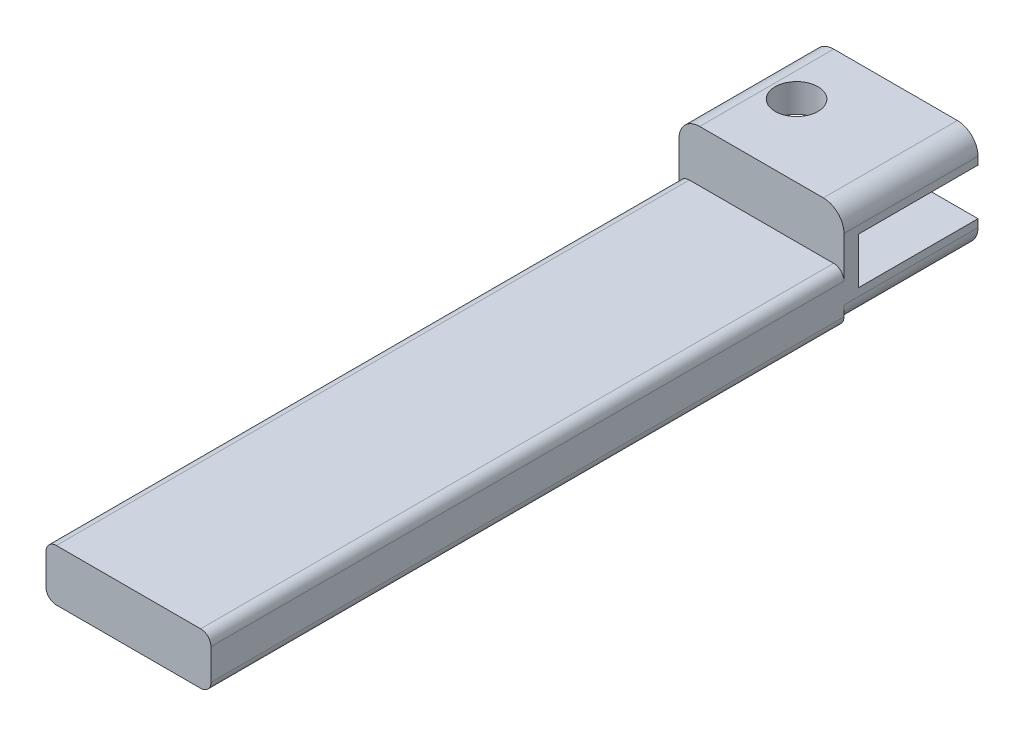
ISO-10303-21;
HEADER;
FILE_DESCRIPTION(('STEP AP214'),'2;1');
FILE_NAME('part.step','',(''),(''),'','','');
FILE_SCHEMA(('AUTOMOTIVE_DESIGN { 1 0 10303 214 1 1 1 1 }'));
ENDSEC;
DATA;
#1=APPLICATION_CONTEXT('core data for automotive mechanical design processes');
#2=APPLICATION_PROTOCOL_DEFINITION('international standard','automotive_design',2000,#1);
#3=PRODUCT_CONTEXT('',#1,'mechanical');
#4=PRODUCT('Part','Part','',(#3));
#5=PRODUCT_RELATED_PRODUCT_CATEGORY('part','',(#4));
#6=PRODUCT_DEFINITION_FORMATION('','',#4);
#7=PRODUCT_DEFINITION_CONTEXT('part definition',#1,'design');
#8=PRODUCT_DEFINITION('design','',#6,#7);
#9=PRODUCT_DEFINITION_SHAPE('','',#8);
#10=(LENGTH_UNIT() NAMED_UNIT(*) SI_UNIT(.MILLI.,.METRE.));
#11=(NAMED_UNIT(*) PLANE_ANGLE_UNIT() SI_UNIT($,.RADIAN.));
#12=(NAMED_UNIT(*) SI_UNIT($,.STERADIAN.) SOLID_ANGLE_UNIT());
#13=UNCERTAINTY_MEASURE_WITH_UNIT(LENGTH_MEASURE(1.E-05),#10,'distance_accuracy_value','');
#14=(GEOMETRIC_REPRESENTATION_CONTEXT(3) GLOBAL_UNCERTAINTY_ASSIGNED_CONTEXT((#13)) GLOBAL_UNIT_ASSIGNED_CONTEXT((#10,
#11,#12)) REPRESENTATION_CONTEXT('',''));
#15=CARTESIAN_POINT('',(0.,0.,0.));
#16=DIRECTION('',(0.,0.,1.));
#17=DIRECTION('',(1.,0.,0.));
#18=AXIS2_PLACEMENT_3D('',#15,#16,#17);
#19=CARTESIAN_POINT('',(8.,-4.,74.40149944));
#20=DIRECTION('',(-1.,0.,0.));
#21=DIRECTION('',(0.,0.,1.));
#22=AXIS2_PLACEMENT_3D('',#19,#20,#21);
#23=PLANE('',#22);
#24=DIRECTION('',(0.,0.,-1.));
#25=VECTOR('',#24,1.);
#26=CARTESIAN_POINT('',(8.,-2.25,74.40149944));
#27=LINE('',#26,#25);
#28=CARTESIAN_POINT('',(8.,-2.25,11.6));
#29=VERTEX_POINT('',#28);
#30=CARTESIAN_POINT('',(8.,-2.25,0.));
#31=VERTEX_POINT('',#30);
#32=EDGE_CURVE('E196',#29,#31,#27,.T.);
#33=ORIENTED_EDGE('',*,*,#32,.F.);
#34=DIRECTION('',(0.,1.,0.));
#35=VECTOR('',#34,1.);
#36=CARTESIAN_POINT('',(8.,-4.,11.6));
#37=LINE('',#36,#35);
#38=CARTESIAN_POINT('',(8.,2.25,11.6));
#39=VERTEX_POINT('',#38);
#40=EDGE_CURVE('E188',#29,#39,#37,.T.);
#41=ORIENTED_EDGE('',*,*,#40,.T.);
#42=DIRECTION('',(0.,0.,1.));
#43=VECTOR('',#42,1.);
#44=CARTESIAN_POINT('',(8.,2.25,74.40149944));
#45=LINE('',#44,#43);
#46=CARTESIAN_POINT('',(8.,2.25,0.));
#47=VERTEX_POINT('',#46);
#48=EDGE_CURVE('E180',#47,#39,#45,.T.);
#49=ORIENTED_EDGE('',*,*,#48,.F.);
#50=DIRECTION('',(0.,1.,0.));
#51=VECTOR('',#50,1.);
#52=CARTESIAN_POINT('',(8.,-3.,0.));
#53=LINE('',#52,#51);
#54=CARTESIAN_POINT('',(8.,3.,0.));
#55=VERTEX_POINT('',#54);
#56=EDGE_CURVE('E221',#47,#55,#53,.T.);
#57=ORIENTED_EDGE('',*,*,#56,.T.);
#58=DIRECTION('',(0.,0.,-1.));
#59=VECTOR('',#58,1.);
#60=CARTESIAN_POINT('',(8.,3.,13.));
#61=LINE('',#60,#59);
#62=CARTESIAN_POINT('',(8.,3.,13.));
#63=VERTEX_POINT('',#62);
#64=EDGE_CURVE('E247',#63,#55,#61,.T.);
#65=ORIENTED_EDGE('',*,*,#64,.F.);
#66=DIRECTION('',(0.,1.,0.));
#67=VECTOR('',#66,1.);
#68=CARTESIAN_POINT('',(8.,-3.,13.));
#69=LINE('',#68,#67);
#70=CARTESIAN_POINT('',(8.,-1.,13.));
#71=VERTEX_POINT('',#70);
#72=EDGE_CURVE('E214',#71,#63,#69,.T.);
#73=ORIENTED_EDGE('',*,*,#72,.F.);
#74=DIRECTION('',(0.,0.,-1.));
#75=VECTOR('',#74,1.);
#76=CARTESIAN_POINT('',(8.,-1.,74.40149944));
#77=LINE('',#76,#75);
#78=CARTESIAN_POINT('',(8.,-1.,74.40149944));
#79=VERTEX_POINT('',#78);
#80=EDGE_CURVE('E309',#79,#71,#77,.T.);
#81=ORIENTED_EDGE('',*,*,#80,.F.);
#82=DIRECTION('',(0.,1.,0.));
#83=VECTOR('',#82,1.);
#84=CARTESIAN_POINT('',(8.,-4.,74.40149944));
#85=LINE('',#84,#83);
#86=CARTESIAN_POINT('',(8.,-4.,74.40149944));
#87=VERTEX_POINT('',#86);
#88=EDGE_CURVE('E269',#87,#79,#85,.T.);
#89=ORIENTED_EDGE('',*,*,#88,.F.);
#90=DIRECTION('',(0.,0.,-1.));
#91=VECTOR('',#90,1.);
#92=CARTESIAN_POINT('',(8.,-4.,74.40149944));
#93=LINE('',#92,#91);
#94=CARTESIAN_POINT('',(8.,-4.,13.));
#95=VERTEX_POINT('',#94);
#96=EDGE_CURVE('E312',#87,#95,#93,.T.);
#97=ORIENTED_EDGE('',*,*,#96,.T.);
#98=DIRECTION('',(0.,1.,0.));
#99=VECTOR('',#98,1.);
#100=CARTESIAN_POINT('',(8.,-4.,13.));
#101=LINE('',#100,#99);
#102=CARTESIAN_POINT('',(8.,-3.,13.));
#103=VERTEX_POINT('',#102);
#104=EDGE_CURVE('E288',#95,#103,#101,.T.);
#105=ORIENTED_EDGE('',*,*,#104,.T.);
#106=DIRECTION('',(0.,0.,-1.));
#107=VECTOR('',#106,1.);
#108=CARTESIAN_POINT('',(8.,-3.,13.));
#109=LINE('',#108,#107);
#110=CARTESIAN_POINT('',(8.,-3.,0.));
#111=VERTEX_POINT('',#110);
#112=EDGE_CURVE('E65',#103,#111,#109,.T.);
#113=ORIENTED_EDGE('',*,*,#112,.T.);
#114=EDGE_CURVE('E228',#111,#31,#53,.T.);
#115=ORIENTED_EDGE('',*,*,#114,.T.);
#116=EDGE_LOOP('',(#33,#41,#49,#57,#65,#73,#81,#89,#97,#105,#113,#115));
#117=FACE_BOUND('',#116,.T.);
#118=ADVANCED_FACE('F39',(#117),#23,.F.);
#119=CARTESIAN_POINT('',(-8.,-1.,74.40149944));
#120=DIRECTION('',(1.,0.,0.));
#121=DIRECTION('',(0.,0.,-1.));
#122=AXIS2_PLACEMENT_3D('',#119,#120,#121);
#123=PLANE('',#122);
#124=DIRECTION('',(0.,0.,1.));
#125=VECTOR('',#124,1.);
#126=CARTESIAN_POINT('',(-8.,-2.25,74.40149944));
#127=LINE('',#126,#125);
#128=CARTESIAN_POINT('',(-8.,-2.25,0.));
#129=VERTEX_POINT('',#128);
#130=CARTESIAN_POINT('',(-8.,-2.25,11.6));
#131=VERTEX_POINT('',#130);
#132=EDGE_CURVE('E184',#129,#131,#127,.T.);
#133=ORIENTED_EDGE('',*,*,#132,.F.);
#134=DIRECTION('',(0.,-1.,0.));
#135=VECTOR('',#134,1.);
#136=CARTESIAN_POINT('',(-8.,3.,0.));
#137=LINE('',#136,#135);
#138=CARTESIAN_POINT('',(-8.,-3.,0.));
#139=VERTEX_POINT('',#138);
#140=EDGE_CURVE('E234',#129,#139,#137,.T.);
#141=ORIENTED_EDGE('',*,*,#140,.T.);
#142=DIRECTION('',(0.,0.,-1.));
#143=VECTOR('',#142,1.);
#144=CARTESIAN_POINT('',(-8.,-3.,13.));
#145=LINE('',#144,#143);
#146=CARTESIAN_POINT('',(-8.,-3.,13.));
#147=VERTEX_POINT('',#146);
#148=EDGE_CURVE('E219',#147,#139,#145,.T.);
#149=ORIENTED_EDGE('',*,*,#148,.F.);
#150=DIRECTION('',(0.,-1.,0.));
#151=VECTOR('',#150,1.);
#152=CARTESIAN_POINT('',(-8.,-1.,13.));
#153=LINE('',#152,#151);
#154=CARTESIAN_POINT('',(-8.,-4.,13.));
#155=VERTEX_POINT('',#154);
#156=EDGE_CURVE('E262',#147,#155,#153,.T.);
#157=ORIENTED_EDGE('',*,*,#156,.T.);
#158=DIRECTION('',(0.,0.,-1.));
#159=VECTOR('',#158,1.);
#160=CARTESIAN_POINT('',(-8.,-4.,74.40149944));
#161=LINE('',#160,#159);
#162=CARTESIAN_POINT('',(-8.,-4.,74.40149944));
#163=VERTEX_POINT('',#162);
#164=EDGE_CURVE('E276',#163,#155,#161,.T.);
#165=ORIENTED_EDGE('',*,*,#164,.F.);
#166=DIRECTION('',(0.,-1.,0.));
#167=VECTOR('',#166,1.);
#168=CARTESIAN_POINT('',(-8.,-1.,74.40149944));
#169=LINE('',#168,#167);
#170=CARTESIAN_POINT('',(-8.,-1.,74.40149944));
#171=VERTEX_POINT('',#170);
#172=EDGE_CURVE('E273',#171,#163,#169,.T.);
#173=ORIENTED_EDGE('',*,*,#172,.F.);
#174=DIRECTION('',(0.,0.,-1.));
#175=VECTOR('',#174,1.);
#176=CARTESIAN_POINT('',(-8.,-1.,74.40149944));
#177=LINE('',#176,#175);
#178=CARTESIAN_POINT('',(-8.,-0.999999999999999,13.));
#179=VERTEX_POINT('',#178);
#180=EDGE_CURVE('E301',#171,#179,#177,.T.);
#181=ORIENTED_EDGE('',*,*,#180,.T.);
#182=DIRECTION('',(0.,-1.,0.));
#183=VECTOR('',#182,1.);
#184=CARTESIAN_POINT('',(-8.,3.,13.));
#185=LINE('',#184,#183);
#186=CARTESIAN_POINT('',(-8.,3.,13.));
#187=VERTEX_POINT('',#186);
#188=EDGE_CURVE('E218',#187,#179,#185,.T.);
#189=ORIENTED_EDGE('',*,*,#188,.F.);
#190=DIRECTION('',(0.,0.,-1.));
#191=VECTOR('',#190,1.);
#192=CARTESIAN_POINT('',(-8.,3.,13.));
#193=LINE('',#192,#191);
#194=CARTESIAN_POINT('',(-8.,3.,0.));
#195=VERTEX_POINT('',#194);
#196=EDGE_CURVE('E237',#187,#195,#193,.T.);
#197=ORIENTED_EDGE('',*,*,#196,.T.);
#198=CARTESIAN_POINT('',(-8.,2.25,0.));
#199=VERTEX_POINT('',#198);
#200=EDGE_CURVE('E209',#195,#199,#137,.T.);
#201=ORIENTED_EDGE('',*,*,#200,.T.);
#202=DIRECTION('',(0.,0.,-1.));
#203=VECTOR('',#202,1.);
#204=CARTESIAN_POINT('',(-8.,2.25,74.40149944));
#205=LINE('',#204,#203);
#206=CARTESIAN_POINT('',(-8.,2.25,11.6));
#207=VERTEX_POINT('',#206);
#208=EDGE_CURVE('E54',#207,#199,#205,.T.);
#209=ORIENTED_EDGE('',*,*,#208,.F.);
#210=DIRECTION('',(0.,-1.,0.));
#211=VECTOR('',#210,1.);
#212=CARTESIAN_POINT('',(-8.,-1.,11.6));
#213=LINE('',#212,#211);
#214=EDGE_CURVE('E11',#207,#131,#213,.T.);
#215=ORIENTED_EDGE('',*,*,#214,.T.);
#216=EDGE_LOOP('',(#133,#141,#149,#157,#165,#173,#181,#189,#197,#201,#209,#215));
#217=FACE_BOUND('',#216,.T.);
#218=ADVANCED_FACE('F333',(#217),#123,.F.);
#219=CARTESIAN_POINT('',(-6.,-3.,0.));
#220=DIRECTION('',(0.,0.,1.));
#221=DIRECTION('',(1.,0.,0.));
#222=AXIS2_PLACEMENT_3D('',#219,#220,#221);
#223=PLANE('',#222);
#224=DIRECTION('',(-1.,0.,0.));
#225=VECTOR('',#224,1.);
#226=CARTESIAN_POINT('',(-6.,-2.25,0.));
#227=LINE('',#226,#225);
#228=EDGE_CURVE('E48',#31,#129,#227,.T.);
#229=ORIENTED_EDGE('',*,*,#228,.F.);
#230=ORIENTED_EDGE('',*,*,#114,.F.);
#231=CARTESIAN_POINT('',(6.,-3.,0.));
#232=DIRECTION('',(0.,0.,1.));
#233=DIRECTION('',(1.,0.,0.));
#234=AXIS2_PLACEMENT_3D('',#231,#232,#233);
#235=CIRCLE('',#234,2.);
#236=CARTESIAN_POINT('',(6.,-5.,0.));
#237=VERTEX_POINT('',#236);
#238=EDGE_CURVE('E222',#237,#111,#235,.T.);
#239=ORIENTED_EDGE('',*,*,#238,.F.);
#240=DIRECTION('',(1.,0.,0.));
#241=VECTOR('',#240,1.);
#242=CARTESIAN_POINT('',(-6.,-5.,0.));
#243=LINE('',#242,#241);
#244=CARTESIAN_POINT('',(-6.,-5.,0.));
#245=VERTEX_POINT('',#244);
#246=EDGE_CURVE('E199',#245,#237,#243,.T.);
#247=ORIENTED_EDGE('',*,*,#246,.F.);
#248=CARTESIAN_POINT('',(-6.,-3.,0.));
#249=DIRECTION('',(0.,0.,1.));
#250=DIRECTION('',(1.,0.,0.));
#251=AXIS2_PLACEMENT_3D('',#248,#249,#250);
#252=CIRCLE('',#251,2.);
#253=EDGE_CURVE('E200',#139,#245,#252,.T.);
#254=ORIENTED_EDGE('',*,*,#253,.F.);
#255=ORIENTED_EDGE('',*,*,#140,.F.);
#256=EDGE_LOOP('',(#229,#230,#239,#247,#254,#255));
#257=FACE_BOUND('',#256,.T.);
#258=ADVANCED_FACE('F332',(#257),#223,.F.);
#259=DIRECTION('',(1.,0.,0.));
#260=VECTOR('',#259,1.);
#261=CARTESIAN_POINT('',(-6.,2.25,0.));
#262=LINE('',#261,#260);
#263=EDGE_CURVE('E181',#199,#47,#262,.T.);
#264=ORIENTED_EDGE('',*,*,#263,.F.);
#265=ORIENTED_EDGE('',*,*,#200,.F.);
#266=CARTESIAN_POINT('',(-6.,3.,0.));
#267=DIRECTION('',(0.,0.,1.));
#268=DIRECTION('',(1.,0.,0.));
#269=AXIS2_PLACEMENT_3D('',#266,#267,#268);
#270=CIRCLE('',#269,2.);
#271=CARTESIAN_POINT('',(-6.,5.,0.));
#272=VERTEX_POINT('',#271);
#273=EDGE_CURVE('E235',#272,#195,#270,.T.);
#274=ORIENTED_EDGE('',*,*,#273,.F.);
#275=DIRECTION('',(-1.,0.,0.));
#276=VECTOR('',#275,1.);
#277=CARTESIAN_POINT('',(6.,5.,0.));
#278=LINE('',#277,#276);
#279=CARTESIAN_POINT('',(6.,5.,0.));
#280=VERTEX_POINT('',#279);
#281=EDGE_CURVE('E229',#280,#272,#278,.T.);
#282=ORIENTED_EDGE('',*,*,#281,.F.);
#283=CARTESIAN_POINT('',(6.,3.,0.));
#284=DIRECTION('',(0.,0.,1.));
#285=DIRECTION('',(1.,0.,0.));
#286=AXIS2_PLACEMENT_3D('',#283,#284,#285);
#287=CIRCLE('',#286,2.);
#288=EDGE_CURVE('E226',#55,#280,#287,.T.);
#289=ORIENTED_EDGE('',*,*,#288,.F.);
#290=ORIENTED_EDGE('',*,*,#56,.F.);
#291=EDGE_LOOP('',(#264,#265,#274,#282,#289,#290));
#292=FACE_BOUND('',#291,.T.);
#293=ADVANCED_FACE('F388',(#292),#223,.F.);
#294=CARTESIAN_POINT('',(-7.,-4.,13.));
#295=DIRECTION('',(0.,0.,1.));
#296=DIRECTION('',(1.,0.,0.));
#297=AXIS2_PLACEMENT_3D('',#294,#295,#296);
#298=PLANE('',#297);
#299=ORIENTED_EDGE('',*,*,#156,.F.);
#300=CARTESIAN_POINT('',(-6.,-3.,13.));
#301=DIRECTION('',(0.,0.,1.));
#302=DIRECTION('',(1.,0.,0.));
#303=AXIS2_PLACEMENT_3D('',#300,#301,#302);
#304=CIRCLE('',#303,2.);
#305=CARTESIAN_POINT('',(-6.,-5.,13.));
#306=VERTEX_POINT('',#305);
#307=EDGE_CURVE('E201',#147,#306,#304,.T.);
#308=ORIENTED_EDGE('',*,*,#307,.T.);
#309=DIRECTION('',(1.,0.,0.));
#310=VECTOR('',#309,1.);
#311=CARTESIAN_POINT('',(-7.,-5.,13.));
#312=LINE('',#311,#310);
#313=CARTESIAN_POINT('',(-7.,-5.,13.));
#314=VERTEX_POINT('',#313);
#315=EDGE_CURVE('E281',#314,#306,#312,.T.);
#316=ORIENTED_EDGE('',*,*,#315,.F.);
#317=CARTESIAN_POINT('',(-7.,-4.,13.));
#318=DIRECTION('',(0.,0.,1.));
#319=DIRECTION('',(1.,0.,0.));
#320=AXIS2_PLACEMENT_3D('',#317,#318,#319);
#321=CIRCLE('',#320,1.);
#322=EDGE_CURVE('E260',#155,#314,#321,.T.);
#323=ORIENTED_EDGE('',*,*,#322,.F.);
#324=EDGE_LOOP('',(#299,#308,#316,#323));
#325=FACE_BOUND('',#324,.T.);
#326=ADVANCED_FACE('F346',(#325),#298,.F.);
#327=CARTESIAN_POINT('',(-7.,-4.,74.40149944));
#328=DIRECTION('',(0.,0.,-1.));
#329=DIRECTION('',(-1.,0.,0.));
#330=AXIS2_PLACEMENT_3D('',#327,#328,#329);
#331=CYLINDRICAL_SURFACE('',#330,1.);
#332=ORIENTED_EDGE('',*,*,#322,.T.);
#333=DIRECTION('',(0.,0.,-1.));
#334=VECTOR('',#333,1.);
#335=CARTESIAN_POINT('',(-7.,-5.,74.40149944));
#336=LINE('',#335,#334);
#337=CARTESIAN_POINT('',(-7.,-5.,74.40149944));
#338=VERTEX_POINT('',#337);
#339=EDGE_CURVE('E316',#338,#314,#336,.T.);
#340=ORIENTED_EDGE('',*,*,#339,.F.);
#341=CARTESIAN_POINT('',(-7.,-4.,74.40149944));
#342=DIRECTION('',(0.,0.,1.));
#343=DIRECTION('',(1.,0.,0.));
#344=AXIS2_PLACEMENT_3D('',#341,#342,#343);
#345=CIRCLE('',#344,1.);
#346=EDGE_CURVE('E258',#163,#338,#345,.T.);
#347=ORIENTED_EDGE('',*,*,#346,.F.);
#348=ORIENTED_EDGE('',*,*,#164,.T.);
#349=EDGE_LOOP('',(#332,#340,#347,#348));
#350=FACE_BOUND('',#349,.T.);
#351=ADVANCED_FACE('F41',(#350),#331,.T.);
#352=CARTESIAN_POINT('',(-7.,-5.,74.40149944));
#353=DIRECTION('',(0.,1.,0.));
#354=DIRECTION('',(0.,0.,1.));
#355=AXIS2_PLACEMENT_3D('',#352,#353,#354);
#356=PLANE('',#355);
#357=CARTESIAN_POINT('',(-3.6,-5.,6.));
#358=DIRECTION('',(0.,1.,0.));
#359=DIRECTION('',(0.,0.,1.));
#360=AXIS2_PLACEMENT_3D('',#357,#358,#359);
#361=CIRCLE('',#360,2.08);
#362=CARTESIAN_POINT('',(-3.6,-5.,8.08));
#363=VERTEX_POINT('',#362);
#364=EDGE_CURVE('E422',#363,#363,#361,.F.);
#365=ORIENTED_EDGE('',*,*,#364,.F.);
#366=EDGE_LOOP('',(#365));
#367=FACE_BOUND('',#366,.T.);
#368=ORIENTED_EDGE('',*,*,#315,.T.);
#369=DIRECTION('',(0.,0.,-1.));
#370=VECTOR('',#369,1.);
#371=CARTESIAN_POINT('',(-6.,-5.,13.));
#372=LINE('',#371,#370);
#373=EDGE_CURVE('E253',#306,#245,#372,.T.);
#374=ORIENTED_EDGE('',*,*,#373,.T.);
#375=ORIENTED_EDGE('',*,*,#246,.T.);
#376=DIRECTION('',(0.,0.,-1.));
#377=VECTOR('',#376,1.);
#378=CARTESIAN_POINT('',(6.,-5.,13.));
#379=LINE('',#378,#377);
#380=CARTESIAN_POINT('',(6.,-5.,13.));
#381=VERTEX_POINT('',#380);
#382=EDGE_CURVE('E255',#381,#237,#379,.T.);
#383=ORIENTED_EDGE('',*,*,#382,.F.);
#384=CARTESIAN_POINT('',(7.,-5.,13.));
#385=VERTEX_POINT('',#384);
#386=EDGE_CURVE('E277',#381,#385,#312,.T.);
#387=ORIENTED_EDGE('',*,*,#386,.T.);
#388=DIRECTION('',(0.,0.,-1.));
#389=VECTOR('',#388,1.);
#390=CARTESIAN_POINT('',(7.,-5.,74.40149944));
#391=LINE('',#390,#389);
#392=CARTESIAN_POINT('',(7.,-5.,74.40149944));
#393=VERTEX_POINT('',#392);
#394=EDGE_CURVE('E317',#393,#385,#391,.T.);
#395=ORIENTED_EDGE('',*,*,#394,.F.);
#396=DIRECTION('',(1.,0.,0.));
#397=VECTOR('',#396,1.);
#398=CARTESIAN_POINT('',(-7.,-5.,74.40149944));
#399=LINE('',#398,#397);
#400=EDGE_CURVE('E265',#338,#393,#399,.T.);
#401=ORIENTED_EDGE('',*,*,#400,.F.);
#402=ORIENTED_EDGE('',*,*,#339,.T.);
#403=EDGE_LOOP('',(#368,#374,#375,#383,#387,#395,#401,#402));
#404=FACE_BOUND('',#403,.T.);
#405=ADVANCED_FACE('F347',(#367,#404),#356,.F.);
#406=CARTESIAN_POINT('',(7.,-4.,74.40149944));
#407=DIRECTION('',(0.,0.,-1.));
#408=DIRECTION('',(-1.,0.,0.));
#409=AXIS2_PLACEMENT_3D('',#406,#407,#408);
#410=CYLINDRICAL_SURFACE('',#409,1.);
#411=CARTESIAN_POINT('',(7.,-4.,13.));
#412=DIRECTION('',(0.,0.,1.));
#413=DIRECTION('',(1.,0.,0.));
#414=AXIS2_PLACEMENT_3D('',#411,#412,#413);
#415=CIRCLE('',#414,1.);
#416=EDGE_CURVE('E283',#385,#95,#415,.T.);
#417=ORIENTED_EDGE('',*,*,#416,.T.);
#418=ORIENTED_EDGE('',*,*,#96,.F.);
#419=CARTESIAN_POINT('',(7.,-4.,74.40149944));
#420=DIRECTION('',(0.,0.,1.));
#421=DIRECTION('',(1.,0.,0.));
#422=AXIS2_PLACEMENT_3D('',#419,#420,#421);
#423=CIRCLE('',#422,1.);
#424=EDGE_CURVE('E264',#393,#87,#423,.T.);
#425=ORIENTED_EDGE('',*,*,#424,.F.);
#426=ORIENTED_EDGE('',*,*,#394,.T.);
#427=EDGE_LOOP('',(#417,#418,#425,#426));
#428=FACE_BOUND('',#427,.T.);
#429=ADVANCED_FACE('F411',(#428),#410,.T.);
#430=CARTESIAN_POINT('',(7.,-1.,74.40149944));
#431=DIRECTION('',(0.,0.,-1.));
#432=DIRECTION('',(-1.,0.,0.));
#433=AXIS2_PLACEMENT_3D('',#430,#431,#432);
#434=CYLINDRICAL_SURFACE('',#433,0.999999999999999);
#435=CARTESIAN_POINT('',(7.,-1.,13.));
#436=DIRECTION('',(0.,0.,1.));
#437=DIRECTION('',(1.,0.,0.));
#438=AXIS2_PLACEMENT_3D('',#435,#436,#437);
#439=CIRCLE('',#438,0.999999999999999);
#440=CARTESIAN_POINT('',(7.,0.,13.));
#441=VERTEX_POINT('',#440);
#442=EDGE_CURVE('E290',#71,#441,#439,.T.);
#443=ORIENTED_EDGE('',*,*,#442,.T.);
#444=DIRECTION('',(0.,0.,-1.));
#445=VECTOR('',#444,1.);
#446=CARTESIAN_POINT('',(7.,0.,74.40149944));
#447=LINE('',#446,#445);
#448=CARTESIAN_POINT('',(7.,0.,74.40149944));
#449=VERTEX_POINT('',#448);
#450=EDGE_CURVE('E310',#449,#441,#447,.T.);
#451=ORIENTED_EDGE('',*,*,#450,.F.);
#452=CARTESIAN_POINT('',(7.,-1.,74.40149944));
#453=DIRECTION('',(0.,0.,1.));
#454=DIRECTION('',(1.,0.,0.));
#455=AXIS2_PLACEMENT_3D('',#452,#453,#454);
#456=CIRCLE('',#455,0.999999999999999);
#457=EDGE_CURVE('E270',#79,#449,#456,.T.);
#458=ORIENTED_EDGE('',*,*,#457,.F.);
#459=ORIENTED_EDGE('',*,*,#80,.T.);
#460=EDGE_LOOP('',(#443,#451,#458,#459));
#461=FACE_BOUND('',#460,.T.);
#462=ADVANCED_FACE('F370',(#461),#434,.T.);
#463=CARTESIAN_POINT('',(7.,0.,74.40149944));
#464=DIRECTION('',(0.,-1.,0.));
#465=DIRECTION('',(0.,0.,-1.));
#466=AXIS2_PLACEMENT_3D('',#463,#464,#465);
#467=PLANE('',#466);
#468=DIRECTION('',(-1.,0.,0.));
#469=VECTOR('',#468,1.);
#470=CARTESIAN_POINT('',(7.,0.,13.));
#471=LINE('',#470,#469);
#472=CARTESIAN_POINT('',(-7.,0.,13.));
#473=VERTEX_POINT('',#472);
#474=EDGE_CURVE('E292',#441,#473,#471,.T.);
#475=ORIENTED_EDGE('',*,*,#474,.T.);
#476=DIRECTION('',(0.,0.,-1.));
#477=VECTOR('',#476,1.);
#478=CARTESIAN_POINT('',(-7.,0.,74.40149944));
#479=LINE('',#478,#477);
#480=CARTESIAN_POINT('',(-7.,0.,74.40149944));
#481=VERTEX_POINT('',#480);
#482=EDGE_CURVE('E302',#481,#473,#479,.T.);
#483=ORIENTED_EDGE('',*,*,#482,.F.);
#484=DIRECTION('',(-1.,0.,0.));
#485=VECTOR('',#484,1.);
#486=CARTESIAN_POINT('',(7.,0.,74.40149944));
#487=LINE('',#486,#485);
#488=EDGE_CURVE('E272',#449,#481,#487,.T.);
#489=ORIENTED_EDGE('',*,*,#488,.F.);
#490=ORIENTED_EDGE('',*,*,#450,.T.);
#491=EDGE_LOOP('',(#475,#483,#489,#490));
#492=FACE_BOUND('',#491,.T.);
#493=ADVANCED_FACE('F365',(#492),#467,.F.);
#494=CARTESIAN_POINT('',(-7.,-0.999999999999999,74.40149944));
#495=DIRECTION('',(0.,0.,-1.));
#496=DIRECTION('',(-1.,0.,0.));
#497=AXIS2_PLACEMENT_3D('',#494,#495,#496);
#498=CYLINDRICAL_SURFACE('',#497,1.);
#499=CARTESIAN_POINT('',(-7.,-0.999999999999999,13.));
#500=DIRECTION('',(0.,0.,1.));
#501=DIRECTION('',(1.,0.,0.));
#502=AXIS2_PLACEMENT_3D('',#499,#500,#501);
#503=CIRCLE('',#502,1.);
#504=EDGE_CURVE('E294',#473,#179,#503,.T.);
#505=ORIENTED_EDGE('',*,*,#504,.T.);
#506=ORIENTED_EDGE('',*,*,#180,.F.);
#507=CARTESIAN_POINT('',(-7.,-0.999999999999999,74.40149944));
#508=DIRECTION('',(0.,0.,1.));
#509=DIRECTION('',(1.,0.,0.));
#510=AXIS2_PLACEMENT_3D('',#507,#508,#509);
#511=CIRCLE('',#510,1.);
#512=EDGE_CURVE('E271',#481,#171,#511,.T.);
#513=ORIENTED_EDGE('',*,*,#512,.F.);
#514=ORIENTED_EDGE('',*,*,#482,.T.);
#515=EDGE_LOOP('',(#505,#506,#513,#514));
#516=FACE_BOUND('',#515,.T.);
#517=ADVANCED_FACE('F357',(#516),#498,.T.);
#518=CARTESIAN_POINT('',(-7.,-4.,74.40149944));
#519=DIRECTION('',(0.,0.,1.));
#520=DIRECTION('',(1.,0.,0.));
#521=AXIS2_PLACEMENT_3D('',#518,#519,#520);
#522=PLANE('',#521);
#523=ORIENTED_EDGE('',*,*,#346,.T.);
#524=ORIENTED_EDGE('',*,*,#400,.T.);
#525=ORIENTED_EDGE('',*,*,#424,.T.);
#526=ORIENTED_EDGE('',*,*,#88,.T.);
#527=ORIENTED_EDGE('',*,*,#457,.T.);
#528=ORIENTED_EDGE('',*,*,#488,.T.);
#529=ORIENTED_EDGE('',*,*,#512,.T.);
#530=ORIENTED_EDGE('',*,*,#172,.T.);
#531=EDGE_LOOP('',(#523,#524,#525,#526,#527,#528,#529,#530));
#532=FACE_BOUND('',#531,.T.);
#533=ADVANCED_FACE('F354',(#532),#522,.T.);
#534=ORIENTED_EDGE('',*,*,#386,.F.);
#535=CARTESIAN_POINT('',(6.,-3.,13.));
#536=DIRECTION('',(0.,0.,1.));
#537=DIRECTION('',(1.,0.,0.));
#538=AXIS2_PLACEMENT_3D('',#535,#536,#537);
#539=CIRCLE('',#538,2.);
#540=EDGE_CURVE('E206',#381,#103,#539,.T.);
#541=ORIENTED_EDGE('',*,*,#540,.T.);
#542=ORIENTED_EDGE('',*,*,#104,.F.);
#543=ORIENTED_EDGE('',*,*,#416,.F.);
#544=EDGE_LOOP('',(#534,#541,#542,#543));
#545=FACE_BOUND('',#544,.T.);
#546=ADVANCED_FACE('F397',(#545),#298,.F.);
#547=CARTESIAN_POINT('',(-6.,-3.,13.));
#548=DIRECTION('',(0.,0.,1.));
#549=DIRECTION('',(1.,0.,0.));
#550=AXIS2_PLACEMENT_3D('',#547,#548,#549);
#551=PLANE('',#550);
#552=ORIENTED_EDGE('',*,*,#504,.F.);
#553=ORIENTED_EDGE('',*,*,#474,.F.);
#554=ORIENTED_EDGE('',*,*,#442,.F.);
#555=ORIENTED_EDGE('',*,*,#72,.T.);
#556=CARTESIAN_POINT('',(6.,3.,13.));
#557=DIRECTION('',(0.,0.,1.));
#558=DIRECTION('',(1.,0.,0.));
#559=AXIS2_PLACEMENT_3D('',#556,#557,#558);
#560=CIRCLE('',#559,2.);
#561=CARTESIAN_POINT('',(6.,5.,13.));
#562=VERTEX_POINT('',#561);
#563=EDGE_CURVE('E215',#63,#562,#560,.T.);
#564=ORIENTED_EDGE('',*,*,#563,.T.);
#565=DIRECTION('',(-1.,0.,0.));
#566=VECTOR('',#565,1.);
#567=CARTESIAN_POINT('',(6.,5.,13.));
#568=LINE('',#567,#566);
#569=CARTESIAN_POINT('',(-6.,5.,13.));
#570=VERTEX_POINT('',#569);
#571=EDGE_CURVE('E212',#562,#570,#568,.T.);
#572=ORIENTED_EDGE('',*,*,#571,.T.);
#573=CARTESIAN_POINT('',(-6.,3.,13.));
#574=DIRECTION('',(0.,0.,1.));
#575=DIRECTION('',(1.,0.,0.));
#576=AXIS2_PLACEMENT_3D('',#573,#574,#575);
#577=CIRCLE('',#576,2.);
#578=EDGE_CURVE('E220',#570,#187,#577,.T.);
#579=ORIENTED_EDGE('',*,*,#578,.T.);
#580=ORIENTED_EDGE('',*,*,#188,.T.);
#581=EDGE_LOOP('',(#552,#553,#554,#555,#564,#572,#579,#580));
#582=FACE_BOUND('',#581,.T.);
#583=ADVANCED_FACE('F359',(#582),#551,.T.);
#584=CARTESIAN_POINT('',(-6.,-3.,13.));
#585=DIRECTION('',(0.,0.,-1.));
#586=DIRECTION('',(-1.,0.,0.));
#587=AXIS2_PLACEMENT_3D('',#584,#585,#586);
#588=CYLINDRICAL_SURFACE('',#587,2.);
#589=ORIENTED_EDGE('',*,*,#253,.T.);
#590=ORIENTED_EDGE('',*,*,#373,.F.);
#591=ORIENTED_EDGE('',*,*,#307,.F.);
#592=ORIENTED_EDGE('',*,*,#148,.T.);
#593=EDGE_LOOP('',(#589,#590,#591,#592));
#594=FACE_BOUND('',#593,.T.);
#595=ADVANCED_FACE('F337',(#594),#588,.T.);
#596=CARTESIAN_POINT('',(6.,-3.,13.));
#597=DIRECTION('',(0.,0.,-1.));
#598=DIRECTION('',(-1.,0.,0.));
#599=AXIS2_PLACEMENT_3D('',#596,#597,#598);
#600=CYLINDRICAL_SURFACE('',#599,2.);
#601=ORIENTED_EDGE('',*,*,#238,.T.);
#602=ORIENTED_EDGE('',*,*,#112,.F.);
#603=ORIENTED_EDGE('',*,*,#540,.F.);
#604=ORIENTED_EDGE('',*,*,#382,.T.);
#605=EDGE_LOOP('',(#601,#602,#603,#604));
#606=FACE_BOUND('',#605,.T.);
#607=ADVANCED_FACE('F454',(#606),#600,.T.);
#608=CARTESIAN_POINT('',(6.,3.,13.));
#609=DIRECTION('',(0.,0.,-1.));
#610=DIRECTION('',(-1.,0.,0.));
#611=AXIS2_PLACEMENT_3D('',#608,#609,#610);
#612=CYLINDRICAL_SURFACE('',#611,2.);
#613=ORIENTED_EDGE('',*,*,#288,.T.);
#614=DIRECTION('',(0.,0.,-1.));
#615=VECTOR('',#614,1.);
#616=CARTESIAN_POINT('',(6.,5.,13.));
#617=LINE('',#616,#615);
#618=EDGE_CURVE('E244',#562,#280,#617,.T.);
#619=ORIENTED_EDGE('',*,*,#618,.F.);
#620=ORIENTED_EDGE('',*,*,#563,.F.);
#621=ORIENTED_EDGE('',*,*,#64,.T.);
#622=EDGE_LOOP('',(#613,#619,#620,#621));
#623=FACE_BOUND('',#622,.T.);
#624=ADVANCED_FACE('F376',(#623),#612,.T.);
#625=CARTESIAN_POINT('',(6.,5.,13.));
#626=DIRECTION('',(0.,-1.,0.));
#627=DIRECTION('',(0.,0.,-1.));
#628=AXIS2_PLACEMENT_3D('',#625,#626,#627);
#629=PLANE('',#628);
#630=CARTESIAN_POINT('',(-3.6,5.,6.));
#631=DIRECTION('',(0.,-1.,0.));
#632=DIRECTION('',(0.,0.,-1.));
#633=AXIS2_PLACEMENT_3D('',#630,#631,#632);
#634=CIRCLE('',#633,2.08);
#635=CARTESIAN_POINT('',(-3.6,5.,3.92));
#636=VERTEX_POINT('',#635);
#637=EDGE_CURVE('E425',#636,#636,#634,.F.);
#638=ORIENTED_EDGE('',*,*,#637,.F.);
#639=EDGE_LOOP('',(#638));
#640=FACE_BOUND('',#639,.T.);
#641=ORIENTED_EDGE('',*,*,#281,.T.);
#642=DIRECTION('',(0.,0.,-1.));
#643=VECTOR('',#642,1.);
#644=CARTESIAN_POINT('',(-6.,5.,13.));
#645=LINE('',#644,#643);
#646=EDGE_CURVE('E245',#570,#272,#645,.T.);
#647=ORIENTED_EDGE('',*,*,#646,.F.);
#648=ORIENTED_EDGE('',*,*,#571,.F.);
#649=ORIENTED_EDGE('',*,*,#618,.T.);
#650=EDGE_LOOP('',(#641,#647,#648,#649));
#651=FACE_BOUND('',#650,.T.);
#652=ADVANCED_FACE('F385',(#640,#651),#629,.F.);
#653=CARTESIAN_POINT('',(-6.,3.,13.));
#654=DIRECTION('',(0.,0.,-1.));
#655=DIRECTION('',(-1.,0.,0.));
#656=AXIS2_PLACEMENT_3D('',#653,#654,#655);
#657=CYLINDRICAL_SURFACE('',#656,2.);
#658=ORIENTED_EDGE('',*,*,#273,.T.);
#659=ORIENTED_EDGE('',*,*,#196,.F.);
#660=ORIENTED_EDGE('',*,*,#578,.F.);
#661=ORIENTED_EDGE('',*,*,#646,.T.);
#662=EDGE_LOOP('',(#658,#659,#660,#661));
#663=FACE_BOUND('',#662,.T.);
#664=ADVANCED_FACE('F389',(#663),#657,.T.);
#665=CARTESIAN_POINT('',(0.,0.,11.6));
#666=DIRECTION('',(0.,0.,1.));
#667=DIRECTION('',(1.,0.,0.));
#668=AXIS2_PLACEMENT_3D('',#665,#666,#667);
#669=PLANE('',#668);
#670=DIRECTION('',(1.,0.,0.));
#671=VECTOR('',#670,1.);
#672=CARTESIAN_POINT('',(-9.,-2.25,11.6));
#673=LINE('',#672,#671);
#674=EDGE_CURVE('E191',#131,#29,#673,.T.);
#675=ORIENTED_EDGE('',*,*,#674,.F.);
#676=ORIENTED_EDGE('',*,*,#214,.F.);
#677=DIRECTION('',(-1.,0.,0.));
#678=VECTOR('',#677,1.);
#679=CARTESIAN_POINT('',(9.,2.25,11.6));
#680=LINE('',#679,#678);
#681=EDGE_CURVE('E179',#39,#207,#680,.T.);
#682=ORIENTED_EDGE('',*,*,#681,.F.);
#683=ORIENTED_EDGE('',*,*,#40,.F.);
#684=EDGE_LOOP('',(#675,#676,#682,#683));
#685=FACE_BOUND('',#684,.T.);
#686=ADVANCED_FACE('F186',(#685),#669,.F.);
#687=CARTESIAN_POINT('',(-9.,-2.25,11.6));
#688=DIRECTION('',(0.,1.,0.));
#689=DIRECTION('',(0.,0.,1.));
#690=AXIS2_PLACEMENT_3D('',#687,#688,#689);
#691=PLANE('',#690);
#692=CARTESIAN_POINT('',(-3.6,-2.25,6.));
#693=DIRECTION('',(0.,1.,0.));
#694=DIRECTION('',(0.,0.,1.));
#695=AXIS2_PLACEMENT_3D('',#692,#693,#694);
#696=CIRCLE('',#695,2.08);
#697=CARTESIAN_POINT('',(-3.6,-2.25,8.08));
#698=VERTEX_POINT('',#697);
#699=EDGE_CURVE('E426',#698,#698,#696,.F.);
#700=ORIENTED_EDGE('',*,*,#699,.T.);
#701=EDGE_LOOP('',(#700));
#702=FACE_BOUND('',#701,.T.);
#703=ORIENTED_EDGE('',*,*,#32,.T.);
#704=ORIENTED_EDGE('',*,*,#228,.T.);
#705=ORIENTED_EDGE('',*,*,#132,.T.);
#706=ORIENTED_EDGE('',*,*,#674,.T.);
#707=EDGE_LOOP('',(#703,#704,#705,#706));
#708=FACE_BOUND('',#707,.T.);
#709=ADVANCED_FACE('F326',(#702,#708),#691,.T.);
#710=CARTESIAN_POINT('',(9.,2.25,11.6));
#711=DIRECTION('',(0.,-1.,0.));
#712=DIRECTION('',(0.,0.,-1.));
#713=AXIS2_PLACEMENT_3D('',#710,#711,#712);
#714=PLANE('',#713);
#715=CARTESIAN_POINT('',(-3.6,2.25,6.));
#716=DIRECTION('',(0.,-1.,0.));
#717=DIRECTION('',(0.,0.,-1.));
#718=AXIS2_PLACEMENT_3D('',#715,#716,#717);
#719=CIRCLE('',#718,2.08);
#720=CARTESIAN_POINT('',(-3.6,2.25,3.92));
#721=VERTEX_POINT('',#720);
#722=EDGE_CURVE('E43',#721,#721,#719,.F.);
#723=ORIENTED_EDGE('',*,*,#722,.T.);
#724=EDGE_LOOP('',(#723));
#725=FACE_BOUND('',#724,.T.);
#726=ORIENTED_EDGE('',*,*,#48,.T.);
#727=ORIENTED_EDGE('',*,*,#681,.T.);
#728=ORIENTED_EDGE('',*,*,#208,.T.);
#729=ORIENTED_EDGE('',*,*,#263,.T.);
#730=EDGE_LOOP('',(#726,#727,#728,#729));
#731=FACE_BOUND('',#730,.T.);
#732=ADVANCED_FACE('F177',(#725,#731),#714,.T.);
#733=CARTESIAN_POINT('',(-3.6,5.2,6.));
#734=DIRECTION('',(0.,-1.,0.));
#735=DIRECTION('',(0.,0.,-1.));
#736=AXIS2_PLACEMENT_3D('',#733,#734,#735);
#737=CYLINDRICAL_SURFACE('',#736,2.08);
#738=ORIENTED_EDGE('',*,*,#722,.F.);
#739=EDGE_LOOP('',(#738));
#740=FACE_BOUND('',#739,.T.);
#741=ORIENTED_EDGE('',*,*,#637,.T.);
#742=EDGE_LOOP('',(#741));
#743=FACE_BOUND('',#742,.T.);
#744=ADVANCED_FACE('F437',(#740,#743),#737,.F.);
#745=ORIENTED_EDGE('',*,*,#699,.F.);
#746=EDGE_LOOP('',(#745));
#747=FACE_BOUND('',#746,.T.);
#748=ORIENTED_EDGE('',*,*,#364,.T.);
#749=EDGE_LOOP('',(#748));
#750=FACE_BOUND('',#749,.T.);
#751=ADVANCED_FACE('F445',(#747,#750),#737,.F.);
#752=CLOSED_SHELL('',(#118,#218,#258,#293,#326,#351,#405,#429,#462,#493,#517,#533,#546,#583,
#595,#607,#624,#652,#664,#686,#709,#732,#744,#751));
#753=MANIFOLD_SOLID_BREP('B2',#752);
#754=ADVANCED_BREP_SHAPE_REPRESENTATION('',(#18,#753),#14);
#755=SHAPE_DEFINITION_REPRESENTATION(#9,#754);
ENDSEC;
END-ISO-10303-21;
